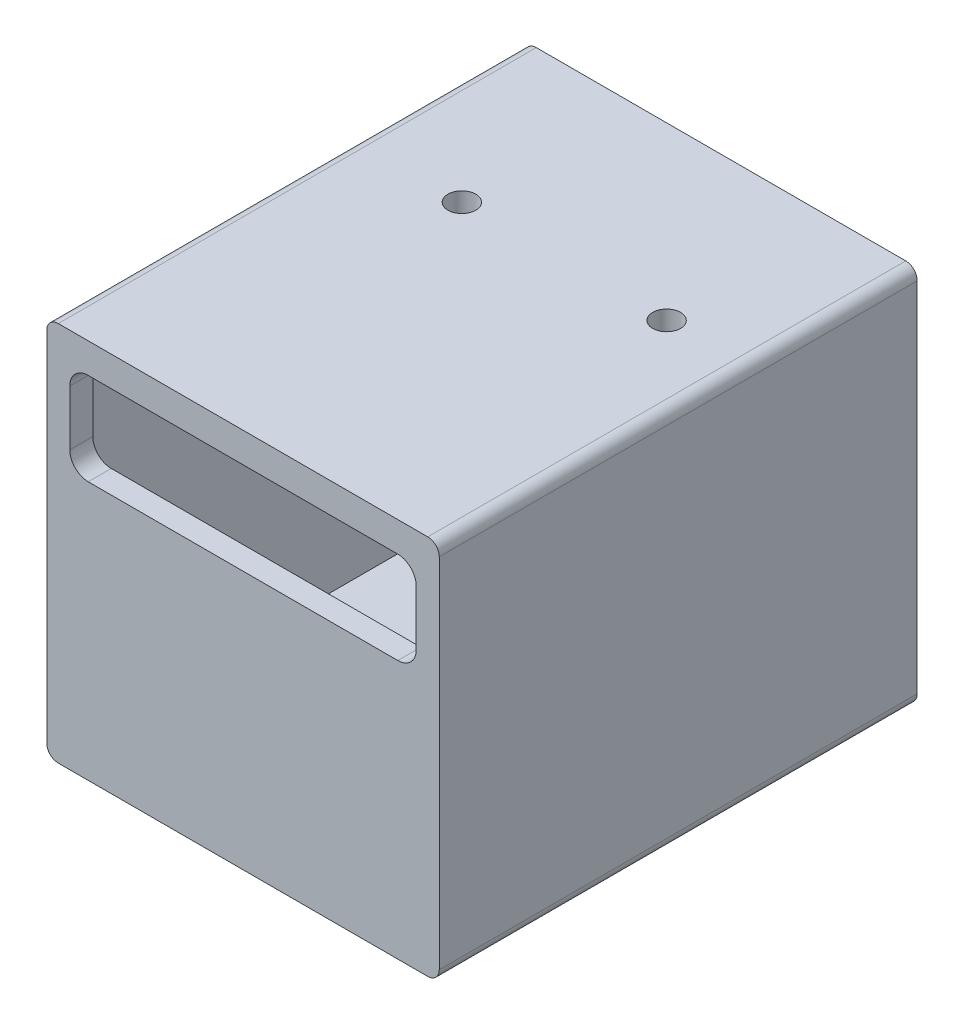
ISO-10303-21;
HEADER;
FILE_DESCRIPTION(('STEP AP214'),'2;1');
FILE_NAME('part.step','',(''),(''),'','','');
FILE_SCHEMA(('AUTOMOTIVE_DESIGN { 1 0 10303 214 1 1 1 1 }'));
ENDSEC;
DATA;
#1=APPLICATION_CONTEXT('core data for automotive mechanical design processes');
#2=APPLICATION_PROTOCOL_DEFINITION('international standard','automotive_design',2000,#1);
#3=PRODUCT_CONTEXT('',#1,'mechanical');
#4=PRODUCT('Part','Part','',(#3));
#5=PRODUCT_RELATED_PRODUCT_CATEGORY('part','',(#4));
#6=PRODUCT_DEFINITION_FORMATION('','',#4);
#7=PRODUCT_DEFINITION_CONTEXT('part definition',#1,'design');
#8=PRODUCT_DEFINITION('design','',#6,#7);
#9=PRODUCT_DEFINITION_SHAPE('','',#8);
#10=(LENGTH_UNIT() NAMED_UNIT(*) SI_UNIT(.MILLI.,.METRE.));
#11=(NAMED_UNIT(*) PLANE_ANGLE_UNIT() SI_UNIT($,.RADIAN.));
#12=(NAMED_UNIT(*) SI_UNIT($,.STERADIAN.) SOLID_ANGLE_UNIT());
#13=UNCERTAINTY_MEASURE_WITH_UNIT(LENGTH_MEASURE(1.E-05),#10,'distance_accuracy_value','');
#14=(GEOMETRIC_REPRESENTATION_CONTEXT(3) GLOBAL_UNCERTAINTY_ASSIGNED_CONTEXT((#13)) GLOBAL_UNIT_ASSIGNED_CONTEXT((#10,
#11,#12)) REPRESENTATION_CONTEXT('',''));
#15=CARTESIAN_POINT('',(0.,0.,0.));
#16=DIRECTION('',(0.,0.,1.));
#17=DIRECTION('',(1.,0.,0.));
#18=AXIS2_PLACEMENT_3D('',#15,#16,#17);
#19=CARTESIAN_POINT('',(-42.608,40.576,182.776));
#20=DIRECTION('',(1.,0.,0.));
#21=DIRECTION('',(0.,1.,0.));
#22=AXIS2_PLACEMENT_3D('',#19,#20,#21);
#23=PLANE('',#22);
#24=DIRECTION('',(0.,1.,0.));
#25=VECTOR('',#24,1.);
#26=CARTESIAN_POINT('',(-42.608,40.576,80.));
#27=LINE('',#26,#25);
#28=CARTESIAN_POINT('',(-42.608,-38.076,80.));
#29=VERTEX_POINT('',#28);
#30=CARTESIAN_POINT('',(-42.608,39.576,80.));
#31=VERTEX_POINT('',#30);
#32=EDGE_CURVE('E275',#29,#31,#27,.T.);
#33=ORIENTED_EDGE('',*,*,#32,.F.);
#34=DIRECTION('',(0.,0.,-1.));
#35=VECTOR('',#34,1.);
#36=CARTESIAN_POINT('',(-42.608,-38.076,182.776));
#37=LINE('',#36,#35);
#38=CARTESIAN_POINT('',(-42.608,-38.076,183.776));
#39=VERTEX_POINT('',#38);
#40=EDGE_CURVE('E11',#29,#39,#37,.F.);
#41=ORIENTED_EDGE('',*,*,#40,.T.);
#42=DIRECTION('',(0.,-1.,0.));
#43=VECTOR('',#42,1.);
#44=CARTESIAN_POINT('',(-42.608,40.576,183.776));
#45=LINE('',#44,#43);
#46=CARTESIAN_POINT('',(-42.608,39.576,183.776));
#47=VERTEX_POINT('',#46);
#48=EDGE_CURVE('E277',#47,#39,#45,.T.);
#49=ORIENTED_EDGE('',*,*,#48,.F.);
#50=DIRECTION('',(0.,0.,1.));
#51=VECTOR('',#50,1.);
#52=CARTESIAN_POINT('',(-42.608,39.576,80.));
#53=LINE('',#52,#51);
#54=EDGE_CURVE('E49',#47,#31,#53,.F.);
#55=ORIENTED_EDGE('',*,*,#54,.T.);
#56=EDGE_LOOP('',(#33,#41,#49,#55));
#57=FACE_BOUND('',#56,.T.);
#58=ADVANCED_FACE('F41',(#57),#23,.F.);
#59=CARTESIAN_POINT('',(-42.608,-40.576,182.776));
#60=DIRECTION('',(0.,1.,0.));
#61=DIRECTION('',(-1.,0.,0.));
#62=AXIS2_PLACEMENT_3D('',#59,#60,#61);
#63=PLANE('',#62);
#64=DIRECTION('',(-1.,0.,0.));
#65=VECTOR('',#64,1.);
#66=CARTESIAN_POINT('',(-42.608,-40.576,80.));
#67=LINE('',#66,#65);
#68=CARTESIAN_POINT('',(40.108,-40.576,80.));
#69=VERTEX_POINT('',#68);
#70=CARTESIAN_POINT('',(-40.108,-40.576,80.));
#71=VERTEX_POINT('',#70);
#72=EDGE_CURVE('E286',#69,#71,#67,.T.);
#73=ORIENTED_EDGE('',*,*,#72,.F.);
#74=DIRECTION('',(0.,0.,-1.));
#75=VECTOR('',#74,1.);
#76=CARTESIAN_POINT('',(40.108,-40.576,182.776));
#77=LINE('',#76,#75);
#78=CARTESIAN_POINT('',(40.108,-40.576,183.776));
#79=VERTEX_POINT('',#78);
#80=EDGE_CURVE('E56',#69,#79,#77,.F.);
#81=ORIENTED_EDGE('',*,*,#80,.T.);
#82=DIRECTION('',(1.,0.,0.));
#83=VECTOR('',#82,1.);
#84=CARTESIAN_POINT('',(-42.608,-40.576,183.776));
#85=LINE('',#84,#83);
#86=CARTESIAN_POINT('',(-40.108,-40.576,183.776));
#87=VERTEX_POINT('',#86);
#88=EDGE_CURVE('E309',#87,#79,#85,.T.);
#89=ORIENTED_EDGE('',*,*,#88,.F.);
#90=DIRECTION('',(0.,0.,-1.));
#91=VECTOR('',#90,1.);
#92=CARTESIAN_POINT('',(-40.108,-40.576,182.776));
#93=LINE('',#92,#91);
#94=EDGE_CURVE('E267',#87,#71,#93,.T.);
#95=ORIENTED_EDGE('',*,*,#94,.T.);
#96=EDGE_LOOP('',(#73,#81,#89,#95));
#97=FACE_BOUND('',#96,.T.);
#98=ADVANCED_FACE('F448',(#97),#63,.F.);
#99=CARTESIAN_POINT('',(42.608,40.576,182.776));
#100=DIRECTION('',(-1.,0.,0.));
#101=DIRECTION('',(0.,-1.,0.));
#102=AXIS2_PLACEMENT_3D('',#99,#100,#101);
#103=PLANE('',#102);
#104=DIRECTION('',(0.,-1.,0.));
#105=VECTOR('',#104,1.);
#106=CARTESIAN_POINT('',(42.608,40.576,80.));
#107=LINE('',#106,#105);
#108=CARTESIAN_POINT('',(42.608,39.576,80.));
#109=VERTEX_POINT('',#108);
#110=CARTESIAN_POINT('',(42.608,-38.076,80.));
#111=VERTEX_POINT('',#110);
#112=EDGE_CURVE('E381',#109,#111,#107,.T.);
#113=ORIENTED_EDGE('',*,*,#112,.F.);
#114=DIRECTION('',(0.,0.,-1.));
#115=VECTOR('',#114,1.);
#116=CARTESIAN_POINT('',(42.608,39.576,183.776));
#117=LINE('',#116,#115);
#118=CARTESIAN_POINT('',(42.608,39.576,183.776));
#119=VERTEX_POINT('',#118);
#120=EDGE_CURVE('E258',#109,#119,#117,.F.);
#121=ORIENTED_EDGE('',*,*,#120,.T.);
#122=DIRECTION('',(0.,1.,0.));
#123=VECTOR('',#122,1.);
#124=CARTESIAN_POINT('',(42.608,-40.576,183.776));
#125=LINE('',#124,#123);
#126=CARTESIAN_POINT('',(42.608,-38.076,183.776));
#127=VERTEX_POINT('',#126);
#128=EDGE_CURVE('E224',#127,#119,#125,.T.);
#129=ORIENTED_EDGE('',*,*,#128,.F.);
#130=DIRECTION('',(0.,0.,-1.));
#131=VECTOR('',#130,1.);
#132=CARTESIAN_POINT('',(42.608,-38.076,182.776));
#133=LINE('',#132,#131);
#134=EDGE_CURVE('E255',#127,#111,#133,.T.);
#135=ORIENTED_EDGE('',*,*,#134,.T.);
#136=EDGE_LOOP('',(#113,#121,#129,#135));
#137=FACE_BOUND('',#136,.T.);
#138=ADVANCED_FACE('F455',(#137),#103,.F.);
#139=CARTESIAN_POINT('',(37.608,35.576,178.776));
#140=DIRECTION('',(1.,0.,0.));
#141=DIRECTION('',(0.,0.,-1.));
#142=AXIS2_PLACEMENT_3D('',#139,#140,#141);
#143=PLANE('',#142);
#144=DIRECTION('',(0.,-1.,0.));
#145=VECTOR('',#144,1.);
#146=CARTESIAN_POINT('',(37.608,35.576,183.776));
#147=LINE('',#146,#145);
#148=CARTESIAN_POINT('',(37.608,31.576,183.776));
#149=VERTEX_POINT('',#148);
#150=CARTESIAN_POINT('',(37.608,19.576,183.776));
#151=VERTEX_POINT('',#150);
#152=EDGE_CURVE('E319',#149,#151,#147,.T.);
#153=ORIENTED_EDGE('',*,*,#152,.F.);
#154=DIRECTION('',(0.,0.,1.));
#155=VECTOR('',#154,1.);
#156=CARTESIAN_POINT('',(37.608,31.576,178.776));
#157=LINE('',#156,#155);
#158=CARTESIAN_POINT('',(37.608,31.576,178.776));
#159=VERTEX_POINT('',#158);
#160=EDGE_CURVE('E406',#149,#159,#157,.F.);
#161=ORIENTED_EDGE('',*,*,#160,.T.);
#162=DIRECTION('',(0.,1.,0.));
#163=VECTOR('',#162,1.);
#164=CARTESIAN_POINT('',(37.608,35.576,178.776));
#165=LINE('',#164,#163);
#166=CARTESIAN_POINT('',(37.608,19.576,178.776));
#167=VERTEX_POINT('',#166);
#168=EDGE_CURVE('E323',#167,#159,#165,.T.);
#169=ORIENTED_EDGE('',*,*,#168,.F.);
#170=DIRECTION('',(0.,0.,1.));
#171=VECTOR('',#170,1.);
#172=CARTESIAN_POINT('',(37.608,19.576,182.776));
#173=LINE('',#172,#171);
#174=EDGE_CURVE('E403',#167,#151,#173,.T.);
#175=ORIENTED_EDGE('',*,*,#174,.T.);
#176=EDGE_LOOP('',(#153,#161,#169,#175));
#177=FACE_BOUND('',#176,.T.);
#178=ADVANCED_FACE('F422',(#177),#143,.F.);
#179=CARTESIAN_POINT('',(-37.608,15.576,178.776));
#180=DIRECTION('',(0.,-1.,0.));
#181=DIRECTION('',(0.,0.,-1.));
#182=AXIS2_PLACEMENT_3D('',#179,#180,#181);
#183=PLANE('',#182);
#184=DIRECTION('',(-1.,0.,0.));
#185=VECTOR('',#184,1.);
#186=CARTESIAN_POINT('',(-37.608,15.576,183.776));
#187=LINE('',#186,#185);
#188=CARTESIAN_POINT('',(33.608,15.576,183.776));
#189=VERTEX_POINT('',#188);
#190=CARTESIAN_POINT('',(-33.608,15.576,183.776));
#191=VERTEX_POINT('',#190);
#192=EDGE_CURVE('E208',#189,#191,#187,.T.);
#193=ORIENTED_EDGE('',*,*,#192,.F.);
#194=DIRECTION('',(0.,0.,1.));
#195=VECTOR('',#194,1.);
#196=CARTESIAN_POINT('',(33.608,15.576,178.776));
#197=LINE('',#196,#195);
#198=CARTESIAN_POINT('',(33.608,15.576,178.776));
#199=VERTEX_POINT('',#198);
#200=EDGE_CURVE('E228',#189,#199,#197,.F.);
#201=ORIENTED_EDGE('',*,*,#200,.T.);
#202=DIRECTION('',(1.,0.,0.));
#203=VECTOR('',#202,1.);
#204=CARTESIAN_POINT('',(-37.608,15.576,178.776));
#205=LINE('',#204,#203);
#206=CARTESIAN_POINT('',(-33.608,15.576,178.776));
#207=VERTEX_POINT('',#206);
#208=EDGE_CURVE('E331',#207,#199,#205,.T.);
#209=ORIENTED_EDGE('',*,*,#208,.F.);
#210=DIRECTION('',(0.,0.,1.));
#211=VECTOR('',#210,1.);
#212=CARTESIAN_POINT('',(-33.608,15.576,182.776));
#213=LINE('',#212,#211);
#214=EDGE_CURVE('E232',#207,#191,#213,.T.);
#215=ORIENTED_EDGE('',*,*,#214,.T.);
#216=EDGE_LOOP('',(#193,#201,#209,#215));
#217=FACE_BOUND('',#216,.T.);
#218=ADVANCED_FACE('F409',(#217),#183,.F.);
#219=CARTESIAN_POINT('',(-37.608,35.576,178.776));
#220=DIRECTION('',(-1.,0.,0.));
#221=DIRECTION('',(0.,0.,1.));
#222=AXIS2_PLACEMENT_3D('',#219,#220,#221);
#223=PLANE('',#222);
#224=DIRECTION('',(0.,1.,0.));
#225=VECTOR('',#224,1.);
#226=CARTESIAN_POINT('',(-37.608,35.576,183.776));
#227=LINE('',#226,#225);
#228=CARTESIAN_POINT('',(-37.608,19.576,183.776));
#229=VERTEX_POINT('',#228);
#230=CARTESIAN_POINT('',(-37.608,31.576,183.776));
#231=VERTEX_POINT('',#230);
#232=EDGE_CURVE('E205',#229,#231,#227,.T.);
#233=ORIENTED_EDGE('',*,*,#232,.F.);
#234=DIRECTION('',(0.,0.,1.));
#235=VECTOR('',#234,1.);
#236=CARTESIAN_POINT('',(-37.608,19.576,178.776));
#237=LINE('',#236,#235);
#238=CARTESIAN_POINT('',(-37.608,19.576,178.776));
#239=VERTEX_POINT('',#238);
#240=EDGE_CURVE('E220',#229,#239,#237,.F.);
#241=ORIENTED_EDGE('',*,*,#240,.T.);
#242=DIRECTION('',(0.,-1.,0.));
#243=VECTOR('',#242,1.);
#244=CARTESIAN_POINT('',(-37.608,35.576,178.776));
#245=LINE('',#244,#243);
#246=CARTESIAN_POINT('',(-37.608,31.576,178.776));
#247=VERTEX_POINT('',#246);
#248=EDGE_CURVE('E329',#247,#239,#245,.T.);
#249=ORIENTED_EDGE('',*,*,#248,.F.);
#250=DIRECTION('',(0.,0.,1.));
#251=VECTOR('',#250,1.);
#252=CARTESIAN_POINT('',(-37.608,31.576,182.776));
#253=LINE('',#252,#251);
#254=EDGE_CURVE('E223',#247,#231,#253,.T.);
#255=ORIENTED_EDGE('',*,*,#254,.T.);
#256=EDGE_LOOP('',(#233,#241,#249,#255));
#257=FACE_BOUND('',#256,.T.);
#258=ADVANCED_FACE('F218',(#257),#223,.F.);
#259=CARTESIAN_POINT('',(-37.608,35.576,178.776));
#260=DIRECTION('',(0.,1.,0.));
#261=DIRECTION('',(0.,0.,1.));
#262=AXIS2_PLACEMENT_3D('',#259,#260,#261);
#263=PLANE('',#262);
#264=DIRECTION('',(1.,0.,0.));
#265=VECTOR('',#264,1.);
#266=CARTESIAN_POINT('',(-37.608,35.576,183.776));
#267=LINE('',#266,#265);
#268=CARTESIAN_POINT('',(-33.608,35.576,183.776));
#269=VERTEX_POINT('',#268);
#270=CARTESIAN_POINT('',(33.608,35.576,183.776));
#271=VERTEX_POINT('',#270);
#272=EDGE_CURVE('E317',#269,#271,#267,.T.);
#273=ORIENTED_EDGE('',*,*,#272,.F.);
#274=DIRECTION('',(0.,0.,1.));
#275=VECTOR('',#274,1.);
#276=CARTESIAN_POINT('',(-33.608,35.576,178.776));
#277=LINE('',#276,#275);
#278=CARTESIAN_POINT('',(-33.608,35.576,178.776));
#279=VERTEX_POINT('',#278);
#280=EDGE_CURVE('E285',#269,#279,#277,.F.);
#281=ORIENTED_EDGE('',*,*,#280,.T.);
#282=DIRECTION('',(-1.,0.,0.));
#283=VECTOR('',#282,1.);
#284=CARTESIAN_POINT('',(-37.608,35.576,178.776));
#285=LINE('',#284,#283);
#286=CARTESIAN_POINT('',(33.608,35.576,178.776));
#287=VERTEX_POINT('',#286);
#288=EDGE_CURVE('E326',#287,#279,#285,.T.);
#289=ORIENTED_EDGE('',*,*,#288,.F.);
#290=DIRECTION('',(0.,0.,1.));
#291=VECTOR('',#290,1.);
#292=CARTESIAN_POINT('',(33.608,35.576,182.776));
#293=LINE('',#292,#291);
#294=EDGE_CURVE('E400',#287,#271,#293,.T.);
#295=ORIENTED_EDGE('',*,*,#294,.T.);
#296=EDGE_LOOP('',(#273,#281,#289,#295));
#297=FACE_BOUND('',#296,.T.);
#298=ADVANCED_FACE('F432',(#297),#263,.F.);
#299=CARTESIAN_POINT('',(33.608,31.576,178.776));
#300=DIRECTION('',(0.,0.,-1.));
#301=DIRECTION('',(-1.,0.,0.));
#302=AXIS2_PLACEMENT_3D('',#299,#300,#301);
#303=CYLINDRICAL_SURFACE('',#302,4.);
#304=CARTESIAN_POINT('',(33.608,31.576,183.776));
#305=DIRECTION('',(0.,0.,1.));
#306=DIRECTION('',(1.,0.,0.));
#307=AXIS2_PLACEMENT_3D('',#304,#305,#306);
#308=CIRCLE('',#307,4.);
#309=EDGE_CURVE('E321',#271,#149,#308,.F.);
#310=ORIENTED_EDGE('',*,*,#309,.F.);
#311=ORIENTED_EDGE('',*,*,#294,.F.);
#312=CARTESIAN_POINT('',(33.608,31.576,178.776));
#313=DIRECTION('',(0.,0.,1.));
#314=DIRECTION('',(1.,0.,0.));
#315=AXIS2_PLACEMENT_3D('',#312,#313,#314);
#316=CIRCLE('',#315,4.);
#317=EDGE_CURVE('E230',#159,#287,#316,.T.);
#318=ORIENTED_EDGE('',*,*,#317,.F.);
#319=ORIENTED_EDGE('',*,*,#160,.F.);
#320=EDGE_LOOP('',(#310,#311,#318,#319));
#321=FACE_BOUND('',#320,.T.);
#322=ADVANCED_FACE('F429',(#321),#303,.F.);
#323=CARTESIAN_POINT('',(33.608,19.576,178.776));
#324=DIRECTION('',(0.,0.,-1.));
#325=DIRECTION('',(-1.,0.,0.));
#326=AXIS2_PLACEMENT_3D('',#323,#324,#325);
#327=CYLINDRICAL_SURFACE('',#326,4.);
#328=CARTESIAN_POINT('',(33.608,19.576,183.776));
#329=DIRECTION('',(0.,0.,1.));
#330=DIRECTION('',(1.,0.,0.));
#331=AXIS2_PLACEMENT_3D('',#328,#329,#330);
#332=CIRCLE('',#331,4.);
#333=EDGE_CURVE('E315',#151,#189,#332,.F.);
#334=ORIENTED_EDGE('',*,*,#333,.F.);
#335=ORIENTED_EDGE('',*,*,#174,.F.);
#336=CARTESIAN_POINT('',(33.608,19.576,178.776));
#337=DIRECTION('',(0.,0.,1.));
#338=DIRECTION('',(1.,0.,0.));
#339=AXIS2_PLACEMENT_3D('',#336,#337,#338);
#340=CIRCLE('',#339,4.);
#341=EDGE_CURVE('E237',#199,#167,#340,.T.);
#342=ORIENTED_EDGE('',*,*,#341,.F.);
#343=ORIENTED_EDGE('',*,*,#200,.F.);
#344=EDGE_LOOP('',(#334,#335,#342,#343));
#345=FACE_BOUND('',#344,.T.);
#346=ADVANCED_FACE('F419',(#345),#327,.F.);
#347=CARTESIAN_POINT('',(-33.608,31.576,178.776));
#348=DIRECTION('',(0.,0.,-1.));
#349=DIRECTION('',(-1.,0.,0.));
#350=AXIS2_PLACEMENT_3D('',#347,#348,#349);
#351=CYLINDRICAL_SURFACE('',#350,4.);
#352=CARTESIAN_POINT('',(-33.608,31.576,183.776));
#353=DIRECTION('',(0.,0.,1.));
#354=DIRECTION('',(1.,0.,0.));
#355=AXIS2_PLACEMENT_3D('',#352,#353,#354);
#356=CIRCLE('',#355,4.);
#357=EDGE_CURVE('E313',#231,#269,#356,.F.);
#358=ORIENTED_EDGE('',*,*,#357,.F.);
#359=ORIENTED_EDGE('',*,*,#254,.F.);
#360=CARTESIAN_POINT('',(-33.608,31.576,178.776));
#361=DIRECTION('',(0.,0.,1.));
#362=DIRECTION('',(1.,0.,0.));
#363=AXIS2_PLACEMENT_3D('',#360,#361,#362);
#364=CIRCLE('',#363,4.);
#365=EDGE_CURVE('E239',#279,#247,#364,.T.);
#366=ORIENTED_EDGE('',*,*,#365,.F.);
#367=ORIENTED_EDGE('',*,*,#280,.F.);
#368=EDGE_LOOP('',(#358,#359,#366,#367));
#369=FACE_BOUND('',#368,.T.);
#370=ADVANCED_FACE('F436',(#369),#351,.F.);
#371=CARTESIAN_POINT('',(-33.608,19.576,178.776));
#372=DIRECTION('',(0.,0.,-1.));
#373=DIRECTION('',(-1.,0.,0.));
#374=AXIS2_PLACEMENT_3D('',#371,#372,#373);
#375=CYLINDRICAL_SURFACE('',#374,4.);
#376=CARTESIAN_POINT('',(-33.608,19.576,183.776));
#377=DIRECTION('',(0.,0.,1.));
#378=DIRECTION('',(1.,0.,0.));
#379=AXIS2_PLACEMENT_3D('',#376,#377,#378);
#380=CIRCLE('',#379,4.);
#381=EDGE_CURVE('E202',#191,#229,#380,.F.);
#382=ORIENTED_EDGE('',*,*,#381,.F.);
#383=ORIENTED_EDGE('',*,*,#214,.F.);
#384=CARTESIAN_POINT('',(-33.608,19.576,178.776));
#385=DIRECTION('',(0.,0.,1.));
#386=DIRECTION('',(1.,0.,0.));
#387=AXIS2_PLACEMENT_3D('',#384,#385,#386);
#388=CIRCLE('',#387,4.);
#389=EDGE_CURVE('E214',#239,#207,#388,.T.);
#390=ORIENTED_EDGE('',*,*,#389,.F.);
#391=ORIENTED_EDGE('',*,*,#240,.F.);
#392=EDGE_LOOP('',(#382,#383,#390,#391));
#393=FACE_BOUND('',#392,.T.);
#394=ADVANCED_FACE('F227',(#393),#375,.F.);
#395=CARTESIAN_POINT('',(0.,0.,80.));
#396=DIRECTION('',(0.,0.,-1.));
#397=DIRECTION('',(-1.,0.,0.));
#398=AXIS2_PLACEMENT_3D('',#395,#396,#397);
#399=PLANE('',#398);
#400=DIRECTION('',(-1.,0.,0.));
#401=VECTOR('',#400,1.);
#402=CARTESIAN_POINT('',(0.,-38.957,80.));
#403=LINE('',#402,#401);
#404=CARTESIAN_POINT('',(40.989,-38.957,80.));
#405=VERTEX_POINT('',#404);
#406=CARTESIAN_POINT('',(-40.989,-38.957,80.));
#407=VERTEX_POINT('',#406);
#408=EDGE_CURVE('E334',#405,#407,#403,.T.);
#409=ORIENTED_EDGE('',*,*,#408,.F.);
#410=DIRECTION('',(0.,-1.,0.));
#411=VECTOR('',#410,1.);
#412=CARTESIAN_POINT('',(40.989,0.,80.));
#413=LINE('',#412,#411);
#414=CARTESIAN_POINT('',(40.989,38.957,80.));
#415=VERTEX_POINT('',#414);
#416=EDGE_CURVE('E338',#415,#405,#413,.T.);
#417=ORIENTED_EDGE('',*,*,#416,.F.);
#418=DIRECTION('',(1.,0.,0.));
#419=VECTOR('',#418,1.);
#420=CARTESIAN_POINT('',(0.,38.957,80.));
#421=LINE('',#420,#419);
#422=CARTESIAN_POINT('',(-40.989,38.957,80.));
#423=VERTEX_POINT('',#422);
#424=EDGE_CURVE('E361',#423,#415,#421,.T.);
#425=ORIENTED_EDGE('',*,*,#424,.F.);
#426=DIRECTION('',(0.,1.,0.));
#427=VECTOR('',#426,1.);
#428=CARTESIAN_POINT('',(-40.989,0.,80.));
#429=LINE('',#428,#427);
#430=EDGE_CURVE('E358',#407,#423,#429,.T.);
#431=ORIENTED_EDGE('',*,*,#430,.F.);
#432=EDGE_LOOP('',(#409,#417,#425,#431));
#433=FACE_BOUND('',#432,.T.);
#434=DIRECTION('',(-1.,0.,0.));
#435=VECTOR('',#434,1.);
#436=CARTESIAN_POINT('',(42.608,42.076,80.));
#437=LINE('',#436,#435);
#438=CARTESIAN_POINT('',(40.108,42.076,80.));
#439=VERTEX_POINT('',#438);
#440=CARTESIAN_POINT('',(-40.108,42.076,80.));
#441=VERTEX_POINT('',#440);
#442=EDGE_CURVE('E295',#439,#441,#437,.T.);
#443=ORIENTED_EDGE('',*,*,#442,.F.);
#444=CARTESIAN_POINT('',(40.108,39.576,80.));
#445=DIRECTION('',(0.,0.,-1.));
#446=DIRECTION('',(-1.,0.,0.));
#447=AXIS2_PLACEMENT_3D('',#444,#445,#446);
#448=CIRCLE('',#447,2.5);
#449=EDGE_CURVE('E253',#439,#109,#448,.T.);
#450=ORIENTED_EDGE('',*,*,#449,.T.);
#451=ORIENTED_EDGE('',*,*,#112,.T.);
#452=CARTESIAN_POINT('',(40.108,-38.076,80.));
#453=DIRECTION('',(0.,0.,-1.));
#454=DIRECTION('',(-1.,0.,0.));
#455=AXIS2_PLACEMENT_3D('',#452,#453,#454);
#456=CIRCLE('',#455,2.5);
#457=EDGE_CURVE('E251',#111,#69,#456,.T.);
#458=ORIENTED_EDGE('',*,*,#457,.T.);
#459=ORIENTED_EDGE('',*,*,#72,.T.);
#460=CARTESIAN_POINT('',(-40.108,-38.076,80.));
#461=DIRECTION('',(0.,0.,-1.));
#462=DIRECTION('',(-1.,0.,0.));
#463=AXIS2_PLACEMENT_3D('',#460,#461,#462);
#464=CIRCLE('',#463,2.5);
#465=EDGE_CURVE('E249',#71,#29,#464,.T.);
#466=ORIENTED_EDGE('',*,*,#465,.T.);
#467=ORIENTED_EDGE('',*,*,#32,.T.);
#468=CARTESIAN_POINT('',(-40.108,39.576,80.));
#469=DIRECTION('',(0.,0.,-1.));
#470=DIRECTION('',(-1.,0.,0.));
#471=AXIS2_PLACEMENT_3D('',#468,#469,#470);
#472=CIRCLE('',#471,2.5);
#473=EDGE_CURVE('E247',#31,#441,#472,.T.);
#474=ORIENTED_EDGE('',*,*,#473,.T.);
#475=EDGE_LOOP('',(#443,#450,#451,#458,#459,#466,#467,#474));
#476=FACE_BOUND('',#475,.T.);
#477=ADVANCED_FACE('F282',(#433,#476),#399,.T.);
#478=CARTESIAN_POINT('',(0.,-38.957,111.));
#479=DIRECTION('',(0.,-1.,0.));
#480=DIRECTION('',(1.,0.,0.));
#481=AXIS2_PLACEMENT_3D('',#478,#479,#480);
#482=PLANE('',#481);
#483=ORIENTED_EDGE('',*,*,#408,.T.);
#484=DIRECTION('',(0.,0.,-1.));
#485=VECTOR('',#484,1.);
#486=CARTESIAN_POINT('',(-40.989,-38.957,111.));
#487=LINE('',#486,#485);
#488=CARTESIAN_POINT('',(-40.989,-38.957,111.));
#489=VERTEX_POINT('',#488);
#490=EDGE_CURVE('E356',#489,#407,#487,.T.);
#491=ORIENTED_EDGE('',*,*,#490,.F.);
#492=DIRECTION('',(-1.,0.,0.));
#493=VECTOR('',#492,1.);
#494=CARTESIAN_POINT('',(0.,-38.957,111.));
#495=LINE('',#494,#493);
#496=CARTESIAN_POINT('',(40.989,-38.957,111.));
#497=VERTEX_POINT('',#496);
#498=EDGE_CURVE('E344',#497,#489,#495,.T.);
#499=ORIENTED_EDGE('',*,*,#498,.F.);
#500=DIRECTION('',(0.,0.,-1.));
#501=VECTOR('',#500,1.);
#502=CARTESIAN_POINT('',(40.989,-38.957,111.));
#503=LINE('',#502,#501);
#504=EDGE_CURVE('E366',#497,#405,#503,.T.);
#505=ORIENTED_EDGE('',*,*,#504,.T.);
#506=EDGE_LOOP('',(#483,#491,#499,#505));
#507=FACE_BOUND('',#506,.T.);
#508=ADVANCED_FACE('F484',(#507),#482,.F.);
#509=CARTESIAN_POINT('',(40.989,0.,111.));
#510=DIRECTION('',(1.,0.,0.));
#511=DIRECTION('',(0.,1.,0.));
#512=AXIS2_PLACEMENT_3D('',#509,#510,#511);
#513=PLANE('',#512);
#514=ORIENTED_EDGE('',*,*,#416,.T.);
#515=ORIENTED_EDGE('',*,*,#504,.F.);
#516=DIRECTION('',(0.,-1.,0.));
#517=VECTOR('',#516,1.);
#518=CARTESIAN_POINT('',(40.989,0.,111.));
#519=LINE('',#518,#517);
#520=CARTESIAN_POINT('',(40.989,38.957,111.));
#521=VERTEX_POINT('',#520);
#522=EDGE_CURVE('E353',#521,#497,#519,.T.);
#523=ORIENTED_EDGE('',*,*,#522,.F.);
#524=DIRECTION('',(0.,0.,-1.));
#525=VECTOR('',#524,1.);
#526=CARTESIAN_POINT('',(40.989,38.957,111.));
#527=LINE('',#526,#525);
#528=EDGE_CURVE('E369',#521,#415,#527,.T.);
#529=ORIENTED_EDGE('',*,*,#528,.T.);
#530=EDGE_LOOP('',(#514,#515,#523,#529));
#531=FACE_BOUND('',#530,.T.);
#532=ADVANCED_FACE('F480',(#531),#513,.F.);
#533=CARTESIAN_POINT('',(0.,38.957,111.));
#534=DIRECTION('',(0.,1.,0.));
#535=DIRECTION('',(-1.,0.,0.));
#536=AXIS2_PLACEMENT_3D('',#533,#534,#535);
#537=PLANE('',#536);
#538=ORIENTED_EDGE('',*,*,#424,.T.);
#539=ORIENTED_EDGE('',*,*,#528,.F.);
#540=DIRECTION('',(1.,0.,0.));
#541=VECTOR('',#540,1.);
#542=CARTESIAN_POINT('',(0.,38.957,111.));
#543=LINE('',#542,#541);
#544=CARTESIAN_POINT('',(-40.989,38.957,111.));
#545=VERTEX_POINT('',#544);
#546=EDGE_CURVE('E350',#545,#521,#543,.T.);
#547=ORIENTED_EDGE('',*,*,#546,.F.);
#548=DIRECTION('',(0.,0.,-1.));
#549=VECTOR('',#548,1.);
#550=CARTESIAN_POINT('',(-40.989,38.957,111.));
#551=LINE('',#550,#549);
#552=EDGE_CURVE('E371',#545,#423,#551,.T.);
#553=ORIENTED_EDGE('',*,*,#552,.T.);
#554=EDGE_LOOP('',(#538,#539,#547,#553));
#555=FACE_BOUND('',#554,.T.);
#556=ADVANCED_FACE('F483',(#555),#537,.F.);
#557=CARTESIAN_POINT('',(-40.989,0.,111.));
#558=DIRECTION('',(-1.,0.,0.));
#559=DIRECTION('',(0.,0.,1.));
#560=AXIS2_PLACEMENT_3D('',#557,#558,#559);
#561=PLANE('',#560);
#562=ORIENTED_EDGE('',*,*,#430,.T.);
#563=ORIENTED_EDGE('',*,*,#552,.F.);
#564=DIRECTION('',(0.,1.,0.));
#565=VECTOR('',#564,1.);
#566=CARTESIAN_POINT('',(-40.989,0.,111.));
#567=LINE('',#566,#565);
#568=EDGE_CURVE('E347',#489,#545,#567,.T.);
#569=ORIENTED_EDGE('',*,*,#568,.F.);
#570=ORIENTED_EDGE('',*,*,#490,.T.);
#571=EDGE_LOOP('',(#562,#563,#569,#570));
#572=FACE_BOUND('',#571,.T.);
#573=ADVANCED_FACE('F478',(#572),#561,.F.);
#574=CARTESIAN_POINT('',(0.,0.,111.));
#575=DIRECTION('',(0.,0.,-1.));
#576=DIRECTION('',(-1.,0.,0.));
#577=AXIS2_PLACEMENT_3D('',#574,#575,#576);
#578=PLANE('',#577);
#579=DIRECTION('',(0.,-1.,0.));
#580=VECTOR('',#579,1.);
#581=CARTESIAN_POINT('',(-38.608,0.,111.));
#582=LINE('',#581,#580);
#583=CARTESIAN_POINT('',(-38.608,36.576,111.));
#584=VERTEX_POINT('',#583);
#585=CARTESIAN_POINT('',(-38.608,-36.576,111.));
#586=VERTEX_POINT('',#585);
#587=EDGE_CURVE('E335',#584,#586,#582,.T.);
#588=ORIENTED_EDGE('',*,*,#587,.T.);
#589=DIRECTION('',(1.,0.,0.));
#590=VECTOR('',#589,1.);
#591=CARTESIAN_POINT('',(0.,-36.576,111.));
#592=LINE('',#591,#590);
#593=CARTESIAN_POINT('',(38.608,-36.576,111.));
#594=VERTEX_POINT('',#593);
#595=EDGE_CURVE('E337',#586,#594,#592,.T.);
#596=ORIENTED_EDGE('',*,*,#595,.T.);
#597=DIRECTION('',(0.,1.,0.));
#598=VECTOR('',#597,1.);
#599=CARTESIAN_POINT('',(38.608,0.,111.));
#600=LINE('',#599,#598);
#601=CARTESIAN_POINT('',(38.608,36.576,111.));
#602=VERTEX_POINT('',#601);
#603=EDGE_CURVE('E340',#594,#602,#600,.T.);
#604=ORIENTED_EDGE('',*,*,#603,.T.);
#605=DIRECTION('',(-1.,0.,0.));
#606=VECTOR('',#605,1.);
#607=CARTESIAN_POINT('',(0.,36.576,111.));
#608=LINE('',#607,#606);
#609=EDGE_CURVE('E342',#602,#584,#608,.T.);
#610=ORIENTED_EDGE('',*,*,#609,.T.);
#611=EDGE_LOOP('',(#588,#596,#604,#610));
#612=FACE_BOUND('',#611,.T.);
#613=ORIENTED_EDGE('',*,*,#498,.T.);
#614=ORIENTED_EDGE('',*,*,#568,.T.);
#615=ORIENTED_EDGE('',*,*,#546,.T.);
#616=ORIENTED_EDGE('',*,*,#522,.T.);
#617=EDGE_LOOP('',(#613,#614,#615,#616));
#618=FACE_BOUND('',#617,.T.);
#619=ADVANCED_FACE('F475',(#612,#618),#578,.T.);
#620=CARTESIAN_POINT('',(0.,0.,178.776));
#621=DIRECTION('',(0.,0.,1.));
#622=DIRECTION('',(1.,0.,0.));
#623=AXIS2_PLACEMENT_3D('',#620,#621,#622);
#624=PLANE('',#623);
#625=ORIENTED_EDGE('',*,*,#248,.T.);
#626=ORIENTED_EDGE('',*,*,#389,.T.);
#627=ORIENTED_EDGE('',*,*,#208,.T.);
#628=ORIENTED_EDGE('',*,*,#341,.T.);
#629=ORIENTED_EDGE('',*,*,#168,.T.);
#630=ORIENTED_EDGE('',*,*,#317,.T.);
#631=ORIENTED_EDGE('',*,*,#288,.T.);
#632=ORIENTED_EDGE('',*,*,#365,.T.);
#633=EDGE_LOOP('',(#625,#626,#627,#628,#629,#630,#631,#632));
#634=FACE_BOUND('',#633,.T.);
#635=DIRECTION('',(0.,-1.,0.));
#636=VECTOR('',#635,1.);
#637=CARTESIAN_POINT('',(-38.608,40.576,178.776));
#638=LINE('',#637,#636);
#639=CARTESIAN_POINT('',(-38.608,36.576,178.776));
#640=VERTEX_POINT('',#639);
#641=CARTESIAN_POINT('',(-38.608,-36.576,178.776));
#642=VERTEX_POINT('',#641);
#643=EDGE_CURVE('E378',#640,#642,#638,.T.);
#644=ORIENTED_EDGE('',*,*,#643,.F.);
#645=DIRECTION('',(-1.,0.,0.));
#646=VECTOR('',#645,1.);
#647=CARTESIAN_POINT('',(-42.608,36.576,178.776));
#648=LINE('',#647,#646);
#649=CARTESIAN_POINT('',(38.608,36.576,178.776));
#650=VERTEX_POINT('',#649);
#651=EDGE_CURVE('E386',#650,#640,#648,.T.);
#652=ORIENTED_EDGE('',*,*,#651,.F.);
#653=DIRECTION('',(0.,1.,0.));
#654=VECTOR('',#653,1.);
#655=CARTESIAN_POINT('',(38.608,40.576,178.776));
#656=LINE('',#655,#654);
#657=CARTESIAN_POINT('',(38.608,-36.576,178.776));
#658=VERTEX_POINT('',#657);
#659=EDGE_CURVE('E391',#658,#650,#656,.T.);
#660=ORIENTED_EDGE('',*,*,#659,.F.);
#661=DIRECTION('',(1.,0.,0.));
#662=VECTOR('',#661,1.);
#663=CARTESIAN_POINT('',(-42.608,-36.576,178.776));
#664=LINE('',#663,#662);
#665=EDGE_CURVE('E382',#642,#658,#664,.T.);
#666=ORIENTED_EDGE('',*,*,#665,.F.);
#667=EDGE_LOOP('',(#644,#652,#660,#666));
#668=FACE_BOUND('',#667,.T.);
#669=ADVANCED_FACE('F413',(#634,#668),#624,.F.);
#670=CARTESIAN_POINT('',(-42.608,36.576,182.776));
#671=DIRECTION('',(0.,-1.,0.));
#672=DIRECTION('',(0.,0.,-1.));
#673=AXIS2_PLACEMENT_3D('',#670,#671,#672);
#674=PLANE('',#673);
#675=DIRECTION('',(0.,0.,-1.));
#676=VECTOR('',#675,1.);
#677=CARTESIAN_POINT('',(-38.608,36.576,182.776));
#678=LINE('',#677,#676);
#679=EDGE_CURVE('E383',#640,#584,#678,.T.);
#680=ORIENTED_EDGE('',*,*,#679,.T.);
#681=ORIENTED_EDGE('',*,*,#609,.F.);
#682=DIRECTION('',(0.,0.,-1.));
#683=VECTOR('',#682,1.);
#684=CARTESIAN_POINT('',(38.608,36.576,182.776));
#685=LINE('',#684,#683);
#686=EDGE_CURVE('E387',#650,#602,#685,.T.);
#687=ORIENTED_EDGE('',*,*,#686,.F.);
#688=ORIENTED_EDGE('',*,*,#651,.T.);
#689=EDGE_LOOP('',(#680,#681,#687,#688));
#690=FACE_BOUND('',#689,.T.);
#691=ADVANCED_FACE('F506',(#690),#674,.T.);
#692=CARTESIAN_POINT('',(38.608,40.576,182.776));
#693=DIRECTION('',(-1.,0.,0.));
#694=DIRECTION('',(0.,-1.,0.));
#695=AXIS2_PLACEMENT_3D('',#692,#693,#694);
#696=PLANE('',#695);
#697=ORIENTED_EDGE('',*,*,#686,.T.);
#698=ORIENTED_EDGE('',*,*,#603,.F.);
#699=DIRECTION('',(0.,0.,-1.));
#700=VECTOR('',#699,1.);
#701=CARTESIAN_POINT('',(38.608,-36.576,182.776));
#702=LINE('',#701,#700);
#703=EDGE_CURVE('E377',#658,#594,#702,.T.);
#704=ORIENTED_EDGE('',*,*,#703,.F.);
#705=ORIENTED_EDGE('',*,*,#659,.T.);
#706=EDGE_LOOP('',(#697,#698,#704,#705));
#707=FACE_BOUND('',#706,.T.);
#708=ADVANCED_FACE('F502',(#707),#696,.T.);
#709=CARTESIAN_POINT('',(-42.608,-36.576,182.776));
#710=DIRECTION('',(0.,1.,0.));
#711=DIRECTION('',(-1.,0.,0.));
#712=AXIS2_PLACEMENT_3D('',#709,#710,#711);
#713=PLANE('',#712);
#714=ORIENTED_EDGE('',*,*,#703,.T.);
#715=ORIENTED_EDGE('',*,*,#595,.F.);
#716=DIRECTION('',(0.,0.,-1.));
#717=VECTOR('',#716,1.);
#718=CARTESIAN_POINT('',(-38.608,-36.576,182.776));
#719=LINE('',#718,#717);
#720=EDGE_CURVE('E368',#642,#586,#719,.T.);
#721=ORIENTED_EDGE('',*,*,#720,.F.);
#722=ORIENTED_EDGE('',*,*,#665,.T.);
#723=EDGE_LOOP('',(#714,#715,#721,#722));
#724=FACE_BOUND('',#723,.T.);
#725=ADVANCED_FACE('F498',(#724),#713,.T.);
#726=CARTESIAN_POINT('',(-38.608,40.576,182.776));
#727=DIRECTION('',(1.,0.,0.));
#728=DIRECTION('',(0.,1.,0.));
#729=AXIS2_PLACEMENT_3D('',#726,#727,#728);
#730=PLANE('',#729);
#731=ORIENTED_EDGE('',*,*,#720,.T.);
#732=ORIENTED_EDGE('',*,*,#587,.F.);
#733=ORIENTED_EDGE('',*,*,#679,.F.);
#734=ORIENTED_EDGE('',*,*,#643,.T.);
#735=EDGE_LOOP('',(#731,#732,#733,#734));
#736=FACE_BOUND('',#735,.T.);
#737=ADVANCED_FACE('F495',(#736),#730,.T.);
#738=CARTESIAN_POINT('',(0.,0.,183.776));
#739=DIRECTION('',(0.,0.,1.));
#740=DIRECTION('',(1.,0.,0.));
#741=AXIS2_PLACEMENT_3D('',#738,#739,#740);
#742=PLANE('',#741);
#743=ORIENTED_EDGE('',*,*,#128,.T.);
#744=CARTESIAN_POINT('',(40.108,39.576,183.776));
#745=DIRECTION('',(0.,0.,1.));
#746=DIRECTION('',(1.,0.,0.));
#747=AXIS2_PLACEMENT_3D('',#744,#745,#746);
#748=CIRCLE('',#747,2.5);
#749=CARTESIAN_POINT('',(40.108,42.076,183.776));
#750=VERTEX_POINT('',#749);
#751=EDGE_CURVE('E265',#119,#750,#748,.T.);
#752=ORIENTED_EDGE('',*,*,#751,.T.);
#753=DIRECTION('',(1.,0.,0.));
#754=VECTOR('',#753,1.);
#755=CARTESIAN_POINT('',(-42.608,42.076,183.776));
#756=LINE('',#755,#754);
#757=CARTESIAN_POINT('',(-40.108,42.076,183.776));
#758=VERTEX_POINT('',#757);
#759=EDGE_CURVE('E293',#758,#750,#756,.T.);
#760=ORIENTED_EDGE('',*,*,#759,.F.);
#761=CARTESIAN_POINT('',(-40.108,39.576,183.776));
#762=DIRECTION('',(0.,0.,1.));
#763=DIRECTION('',(1.,0.,0.));
#764=AXIS2_PLACEMENT_3D('',#761,#762,#763);
#765=CIRCLE('',#764,2.5);
#766=EDGE_CURVE('E260',#758,#47,#765,.T.);
#767=ORIENTED_EDGE('',*,*,#766,.T.);
#768=ORIENTED_EDGE('',*,*,#48,.T.);
#769=CARTESIAN_POINT('',(-40.108,-38.076,183.776));
#770=DIRECTION('',(0.,0.,1.));
#771=DIRECTION('',(1.,0.,0.));
#772=AXIS2_PLACEMENT_3D('',#769,#770,#771);
#773=CIRCLE('',#772,2.5);
#774=EDGE_CURVE('E63',#39,#87,#773,.T.);
#775=ORIENTED_EDGE('',*,*,#774,.T.);
#776=ORIENTED_EDGE('',*,*,#88,.T.);
#777=CARTESIAN_POINT('',(40.108,-38.076,183.776));
#778=DIRECTION('',(0.,0.,1.));
#779=DIRECTION('',(1.,0.,0.));
#780=AXIS2_PLACEMENT_3D('',#777,#778,#779);
#781=CIRCLE('',#780,2.5);
#782=EDGE_CURVE('E263',#79,#127,#781,.T.);
#783=ORIENTED_EDGE('',*,*,#782,.T.);
#784=EDGE_LOOP('',(#743,#752,#760,#767,#768,#775,#776,#783));
#785=FACE_BOUND('',#784,.T.);
#786=ORIENTED_EDGE('',*,*,#309,.T.);
#787=ORIENTED_EDGE('',*,*,#152,.T.);
#788=ORIENTED_EDGE('',*,*,#333,.T.);
#789=ORIENTED_EDGE('',*,*,#192,.T.);
#790=ORIENTED_EDGE('',*,*,#381,.T.);
#791=ORIENTED_EDGE('',*,*,#232,.T.);
#792=ORIENTED_EDGE('',*,*,#357,.T.);
#793=ORIENTED_EDGE('',*,*,#272,.T.);
#794=EDGE_LOOP('',(#786,#787,#788,#789,#790,#791,#792,#793));
#795=FACE_BOUND('',#794,.T.);
#796=ADVANCED_FACE('F204',(#785,#795),#742,.T.);
#797=CARTESIAN_POINT('',(0.,42.076,0.));
#798=DIRECTION('',(0.,1.,0.));
#799=DIRECTION('',(0.,0.,1.));
#800=AXIS2_PLACEMENT_3D('',#797,#798,#799);
#801=PLANE('',#800);
#802=CARTESIAN_POINT('',(25.3394744031571,42.076,117.147952380952));
#803=DIRECTION('',(0.,1.,0.));
#804=DIRECTION('',(0.,0.,1.));
#805=AXIS2_PLACEMENT_3D('',#802,#803,#804);
#806=CIRCLE('',#805,3.025);
#807=CARTESIAN_POINT('',(25.3394744031571,42.076,120.172952380952));
#808=VERTEX_POINT('',#807);
#809=EDGE_CURVE('E302',#808,#808,#806,.T.);
#810=ORIENTED_EDGE('',*,*,#809,.F.);
#811=EDGE_LOOP('',(#810));
#812=FACE_BOUND('',#811,.T.);
#813=CARTESIAN_POINT('',(-19.1105255968429,42.076,117.147952380952));
#814=DIRECTION('',(0.,1.,0.));
#815=DIRECTION('',(0.,0.,1.));
#816=AXIS2_PLACEMENT_3D('',#813,#814,#815);
#817=CIRCLE('',#816,3.025);
#818=CARTESIAN_POINT('',(-19.1105255968429,42.076,120.172952380952));
#819=VERTEX_POINT('',#818);
#820=EDGE_CURVE('E792',#819,#819,#817,.T.);
#821=ORIENTED_EDGE('',*,*,#820,.F.);
#822=EDGE_LOOP('',(#821));
#823=FACE_BOUND('',#822,.T.);
#824=ORIENTED_EDGE('',*,*,#759,.T.);
#825=DIRECTION('',(0.,0.,-1.));
#826=VECTOR('',#825,1.);
#827=CARTESIAN_POINT('',(40.108,42.076,80.));
#828=LINE('',#827,#826);
#829=EDGE_CURVE('E244',#750,#439,#828,.T.);
#830=ORIENTED_EDGE('',*,*,#829,.T.);
#831=ORIENTED_EDGE('',*,*,#442,.T.);
#832=DIRECTION('',(0.,0.,1.));
#833=VECTOR('',#832,1.);
#834=CARTESIAN_POINT('',(-40.108,42.076,183.776));
#835=LINE('',#834,#833);
#836=EDGE_CURVE('E213',#441,#758,#835,.T.);
#837=ORIENTED_EDGE('',*,*,#836,.T.);
#838=EDGE_LOOP('',(#824,#830,#831,#837));
#839=FACE_BOUND('',#838,.T.);
#840=ADVANCED_FACE('F292',(#812,#823,#839),#801,.T.);
#841=CARTESIAN_POINT('',(40.108,39.576,0.));
#842=DIRECTION('',(0.,0.,1.));
#843=DIRECTION('',(1.,0.,0.));
#844=AXIS2_PLACEMENT_3D('',#841,#842,#843);
#845=CYLINDRICAL_SURFACE('',#844,2.5);
#846=ORIENTED_EDGE('',*,*,#751,.F.);
#847=ORIENTED_EDGE('',*,*,#120,.F.);
#848=ORIENTED_EDGE('',*,*,#449,.F.);
#849=ORIENTED_EDGE('',*,*,#829,.F.);
#850=EDGE_LOOP('',(#846,#847,#848,#849));
#851=FACE_BOUND('',#850,.T.);
#852=ADVANCED_FACE('F596',(#851),#845,.T.);
#853=CARTESIAN_POINT('',(40.108,-38.076,182.776));
#854=DIRECTION('',(0.,0.,-1.));
#855=DIRECTION('',(-1.,0.,0.));
#856=AXIS2_PLACEMENT_3D('',#853,#854,#855);
#857=CYLINDRICAL_SURFACE('',#856,2.5);
#858=ORIENTED_EDGE('',*,*,#782,.F.);
#859=ORIENTED_EDGE('',*,*,#80,.F.);
#860=ORIENTED_EDGE('',*,*,#457,.F.);
#861=ORIENTED_EDGE('',*,*,#134,.F.);
#862=EDGE_LOOP('',(#858,#859,#860,#861));
#863=FACE_BOUND('',#862,.T.);
#864=ADVANCED_FACE('F605',(#863),#857,.T.);
#865=CARTESIAN_POINT('',(-40.108,-38.076,182.776));
#866=DIRECTION('',(0.,0.,-1.));
#867=DIRECTION('',(-1.,0.,0.));
#868=AXIS2_PLACEMENT_3D('',#865,#866,#867);
#869=CYLINDRICAL_SURFACE('',#868,2.5);
#870=ORIENTED_EDGE('',*,*,#774,.F.);
#871=ORIENTED_EDGE('',*,*,#40,.F.);
#872=ORIENTED_EDGE('',*,*,#465,.F.);
#873=ORIENTED_EDGE('',*,*,#94,.F.);
#874=EDGE_LOOP('',(#870,#871,#872,#873));
#875=FACE_BOUND('',#874,.T.);
#876=ADVANCED_FACE('F614',(#875),#869,.T.);
#877=CARTESIAN_POINT('',(-40.108,39.576,0.));
#878=DIRECTION('',(0.,0.,-1.));
#879=DIRECTION('',(-1.,0.,0.));
#880=AXIS2_PLACEMENT_3D('',#877,#878,#879);
#881=CYLINDRICAL_SURFACE('',#880,2.5);
#882=ORIENTED_EDGE('',*,*,#473,.F.);
#883=ORIENTED_EDGE('',*,*,#54,.F.);
#884=ORIENTED_EDGE('',*,*,#766,.F.);
#885=ORIENTED_EDGE('',*,*,#836,.F.);
#886=EDGE_LOOP('',(#882,#883,#884,#885));
#887=FACE_BOUND('',#886,.T.);
#888=ADVANCED_FACE('F43',(#887),#881,.T.);
#889=CARTESIAN_POINT('',(-19.1105255968429,37.076,117.147952380952));
#890=DIRECTION('',(0.,1.,0.));
#891=DIRECTION('',(0.,0.,1.));
#892=AXIS2_PLACEMENT_3D('',#889,#890,#891);
#893=CYLINDRICAL_SURFACE('',#892,3.025);
#894=CARTESIAN_POINT('',(-19.1105255968429,37.076,117.147952380952));
#895=DIRECTION('',(0.,1.,0.));
#896=DIRECTION('',(0.,0.,1.));
#897=AXIS2_PLACEMENT_3D('',#894,#895,#896);
#898=CIRCLE('',#897,3.025);
#899=CARTESIAN_POINT('',(-19.1105255968429,37.076,120.172952380952));
#900=VERTEX_POINT('',#899);
#901=EDGE_CURVE('E305',#900,#900,#898,.T.);
#902=ORIENTED_EDGE('',*,*,#901,.F.);
#903=EDGE_LOOP('',(#902));
#904=FACE_BOUND('',#903,.T.);
#905=ORIENTED_EDGE('',*,*,#820,.T.);
#906=EDGE_LOOP('',(#905));
#907=FACE_BOUND('',#906,.T.);
#908=ADVANCED_FACE('F630',(#904,#907),#893,.F.);
#909=CARTESIAN_POINT('',(-19.1105255968429,37.076,117.147952380952));
#910=DIRECTION('',(0.,1.,0.));
#911=DIRECTION('',(0.,0.,1.));
#912=AXIS2_PLACEMENT_3D('',#909,#910,#911);
#913=PLANE('',#912);
#914=ORIENTED_EDGE('',*,*,#901,.T.);
#915=EDGE_LOOP('',(#914));
#916=FACE_BOUND('',#915,.T.);
#917=ADVANCED_FACE('F637',(#916),#913,.T.);
#918=CARTESIAN_POINT('',(25.3394744031571,37.076,117.147952380952));
#919=DIRECTION('',(0.,1.,0.));
#920=DIRECTION('',(0.,0.,1.));
#921=AXIS2_PLACEMENT_3D('',#918,#919,#920);
#922=CYLINDRICAL_SURFACE('',#921,3.025);
#923=CARTESIAN_POINT('',(25.3394744031571,37.076,117.147952380952));
#924=DIRECTION('',(0.,1.,0.));
#925=DIRECTION('',(0.,0.,1.));
#926=AXIS2_PLACEMENT_3D('',#923,#924,#925);
#927=CIRCLE('',#926,3.025);
#928=CARTESIAN_POINT('',(25.3394744031571,37.076,120.172952380952));
#929=VERTEX_POINT('',#928);
#930=EDGE_CURVE('E298',#929,#929,#927,.T.);
#931=ORIENTED_EDGE('',*,*,#930,.F.);
#932=EDGE_LOOP('',(#931));
#933=FACE_BOUND('',#932,.T.);
#934=ORIENTED_EDGE('',*,*,#809,.T.);
#935=EDGE_LOOP('',(#934));
#936=FACE_BOUND('',#935,.T.);
#937=ADVANCED_FACE('F646',(#933,#936),#922,.F.);
#938=CARTESIAN_POINT('',(25.3394744031571,37.076,117.147952380952));
#939=DIRECTION('',(0.,1.,0.));
#940=DIRECTION('',(0.,0.,1.));
#941=AXIS2_PLACEMENT_3D('',#938,#939,#940);
#942=PLANE('',#941);
#943=ORIENTED_EDGE('',*,*,#930,.T.);
#944=EDGE_LOOP('',(#943));
#945=FACE_BOUND('',#944,.T.);
#946=ADVANCED_FACE('F655',(#945),#942,.T.);
#947=CLOSED_SHELL('',(#58,#98,#138,#178,#218,#258,#298,#322,#346,#370,#394,#477,#508,#532,#556,
#573,#619,#669,#691,#708,#725,#737,#796,#840,#852,#864,#876,#888,#908,#917,#937,#946));
#948=MANIFOLD_SOLID_BREP('B2',#947);
#949=ADVANCED_BREP_SHAPE_REPRESENTATION('',(#18,#948),#14);
#950=SHAPE_DEFINITION_REPRESENTATION(#9,#949);
ENDSEC;
END-ISO-10303-21;
